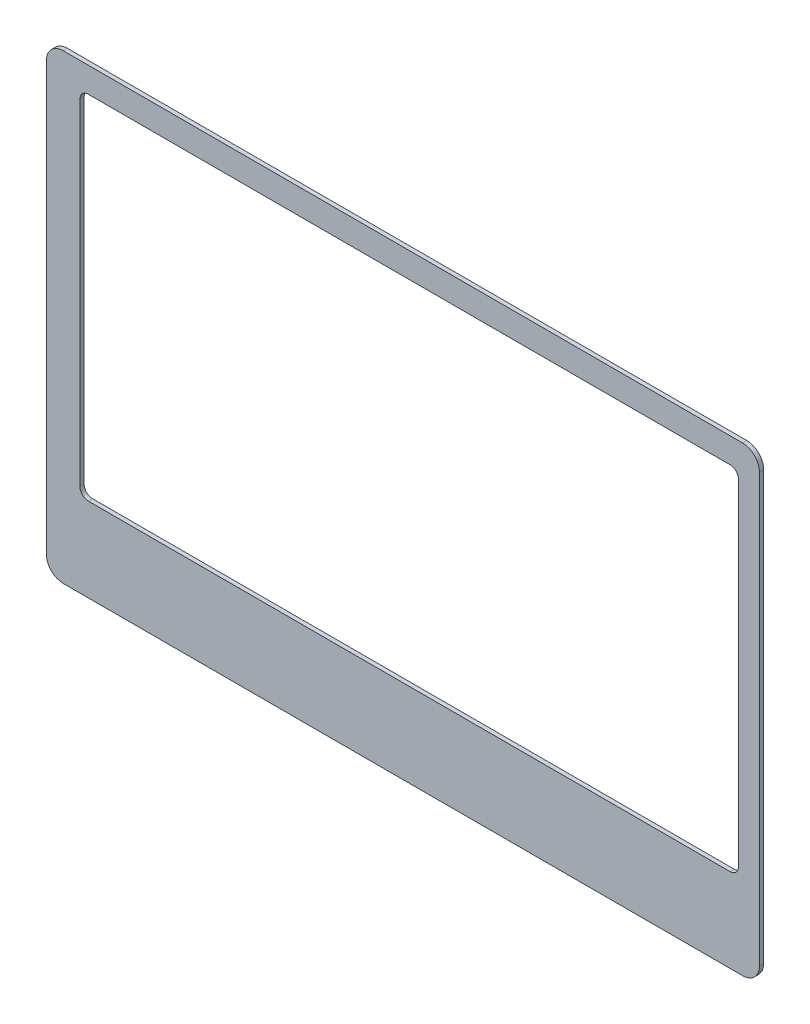
ISO-10303-21;
HEADER;
FILE_DESCRIPTION(('STEP AP214'),'2;1');
FILE_NAME('part.step','',(''),(''),'','','');
FILE_SCHEMA(('AUTOMOTIVE_DESIGN { 1 0 10303 214 1 1 1 1 }'));
ENDSEC;
DATA;
#1=APPLICATION_CONTEXT('core data for automotive mechanical design processes');
#2=APPLICATION_PROTOCOL_DEFINITION('international standard','automotive_design',2000,#1);
#3=PRODUCT_CONTEXT('',#1,'mechanical');
#4=PRODUCT('Part','Part','',(#3));
#5=PRODUCT_RELATED_PRODUCT_CATEGORY('part','',(#4));
#6=PRODUCT_DEFINITION_FORMATION('','',#4);
#7=PRODUCT_DEFINITION_CONTEXT('part definition',#1,'design');
#8=PRODUCT_DEFINITION('design','',#6,#7);
#9=PRODUCT_DEFINITION_SHAPE('','',#8);
#10=(LENGTH_UNIT() NAMED_UNIT(*) SI_UNIT(.MILLI.,.METRE.));
#11=(NAMED_UNIT(*) PLANE_ANGLE_UNIT() SI_UNIT($,.RADIAN.));
#12=(NAMED_UNIT(*) SI_UNIT($,.STERADIAN.) SOLID_ANGLE_UNIT());
#13=UNCERTAINTY_MEASURE_WITH_UNIT(LENGTH_MEASURE(1.E-05),#10,'distance_accuracy_value','');
#14=(GEOMETRIC_REPRESENTATION_CONTEXT(3) GLOBAL_UNCERTAINTY_ASSIGNED_CONTEXT((#13)) GLOBAL_UNIT_ASSIGNED_CONTEXT((#10,
#11,#12)) REPRESENTATION_CONTEXT('',''));
#15=CARTESIAN_POINT('',(0.,0.,0.));
#16=DIRECTION('',(0.,0.,1.));
#17=DIRECTION('',(1.,0.,0.));
#18=AXIS2_PLACEMENT_3D('',#15,#16,#17);
#19=CARTESIAN_POINT('',(42.5,27.5,0.5));
#20=DIRECTION('',(-1.,0.,0.));
#21=DIRECTION('',(0.,0.,1.));
#22=AXIS2_PLACEMENT_3D('',#19,#20,#21);
#23=PLANE('',#22);
#24=DIRECTION('',(0.,1.,0.));
#25=VECTOR('',#24,1.);
#26=CARTESIAN_POINT('',(42.5,27.5,0.5));
#27=LINE('',#26,#25);
#28=CARTESIAN_POINT('',(42.5,-25.5,0.5));
#29=VERTEX_POINT('',#28);
#30=CARTESIAN_POINT('',(42.5,25.5,0.5));
#31=VERTEX_POINT('',#30);
#32=EDGE_CURVE('E245',#29,#31,#27,.T.);
#33=ORIENTED_EDGE('',*,*,#32,.F.);
#34=DIRECTION('',(0.,0.,-1.));
#35=VECTOR('',#34,1.);
#36=CARTESIAN_POINT('',(42.5,-25.5,0.5));
#37=LINE('',#36,#35);
#38=CARTESIAN_POINT('',(42.5,-25.5,0.));
#39=VERTEX_POINT('',#38);
#40=EDGE_CURVE('E276',#29,#39,#37,.T.);
#41=ORIENTED_EDGE('',*,*,#40,.T.);
#42=DIRECTION('',(0.,1.,0.));
#43=VECTOR('',#42,1.);
#44=CARTESIAN_POINT('',(42.5,27.5,0.));
#45=LINE('',#44,#43);
#46=CARTESIAN_POINT('',(42.5,25.5,0.));
#47=VERTEX_POINT('',#46);
#48=EDGE_CURVE('E183',#39,#47,#45,.T.);
#49=ORIENTED_EDGE('',*,*,#48,.T.);
#50=DIRECTION('',(0.,0.,-1.));
#51=VECTOR('',#50,1.);
#52=CARTESIAN_POINT('',(42.5,25.5,0.5));
#53=LINE('',#52,#51);
#54=EDGE_CURVE('E260',#47,#31,#53,.F.);
#55=ORIENTED_EDGE('',*,*,#54,.T.);
#56=EDGE_LOOP('',(#33,#41,#49,#55));
#57=FACE_BOUND('',#56,.T.);
#58=ADVANCED_FACE('F45',(#57),#23,.F.);
#59=CARTESIAN_POINT('',(-42.5,27.5,0.5));
#60=DIRECTION('',(0.,-1.,0.));
#61=DIRECTION('',(0.,0.,-1.));
#62=AXIS2_PLACEMENT_3D('',#59,#60,#61);
#63=PLANE('',#62);
#64=DIRECTION('',(-1.,0.,0.));
#65=VECTOR('',#64,1.);
#66=CARTESIAN_POINT('',(-42.5,27.5,0.5));
#67=LINE('',#66,#65);
#68=CARTESIAN_POINT('',(40.5,27.5,0.5));
#69=VERTEX_POINT('',#68);
#70=CARTESIAN_POINT('',(-40.5,27.5,0.5));
#71=VERTEX_POINT('',#70);
#72=EDGE_CURVE('E249',#69,#71,#67,.T.);
#73=ORIENTED_EDGE('',*,*,#72,.F.);
#74=DIRECTION('',(0.,0.,-1.));
#75=VECTOR('',#74,1.);
#76=CARTESIAN_POINT('',(40.5,27.5,0.5));
#77=LINE('',#76,#75);
#78=CARTESIAN_POINT('',(40.5,27.5,0.));
#79=VERTEX_POINT('',#78);
#80=EDGE_CURVE('E11',#69,#79,#77,.T.);
#81=ORIENTED_EDGE('',*,*,#80,.T.);
#82=DIRECTION('',(-1.,0.,0.));
#83=VECTOR('',#82,1.);
#84=CARTESIAN_POINT('',(-42.5,27.5,0.));
#85=LINE('',#84,#83);
#86=CARTESIAN_POINT('',(-40.5,27.5,0.));
#87=VERTEX_POINT('',#86);
#88=EDGE_CURVE('E264',#79,#87,#85,.T.);
#89=ORIENTED_EDGE('',*,*,#88,.T.);
#90=DIRECTION('',(0.,0.,-1.));
#91=VECTOR('',#90,1.);
#92=CARTESIAN_POINT('',(-40.5,27.5,0.5));
#93=LINE('',#92,#91);
#94=EDGE_CURVE('E54',#87,#71,#93,.F.);
#95=ORIENTED_EDGE('',*,*,#94,.T.);
#96=EDGE_LOOP('',(#73,#81,#89,#95));
#97=FACE_BOUND('',#96,.T.);
#98=ADVANCED_FACE('F319',(#97),#63,.F.);
#99=CARTESIAN_POINT('',(-42.5,27.5,0.5));
#100=DIRECTION('',(1.,0.,0.));
#101=DIRECTION('',(0.,1.,0.));
#102=AXIS2_PLACEMENT_3D('',#99,#100,#101);
#103=PLANE('',#102);
#104=DIRECTION('',(0.,-1.,0.));
#105=VECTOR('',#104,1.);
#106=CARTESIAN_POINT('',(-42.5,27.5,0.));
#107=LINE('',#106,#105);
#108=CARTESIAN_POINT('',(-42.5,25.5,0.));
#109=VERTEX_POINT('',#108);
#110=CARTESIAN_POINT('',(-42.5,-25.5,0.));
#111=VERTEX_POINT('',#110);
#112=EDGE_CURVE('E268',#109,#111,#107,.T.);
#113=ORIENTED_EDGE('',*,*,#112,.T.);
#114=DIRECTION('',(0.,0.,-1.));
#115=VECTOR('',#114,1.);
#116=CARTESIAN_POINT('',(-42.5,-25.5,0.5));
#117=LINE('',#116,#115);
#118=CARTESIAN_POINT('',(-42.5,-25.5,0.5));
#119=VERTEX_POINT('',#118);
#120=EDGE_CURVE('E61',#111,#119,#117,.F.);
#121=ORIENTED_EDGE('',*,*,#120,.T.);
#122=DIRECTION('',(0.,-1.,0.));
#123=VECTOR('',#122,1.);
#124=CARTESIAN_POINT('',(-42.5,27.5,0.5));
#125=LINE('',#124,#123);
#126=CARTESIAN_POINT('',(-42.5,25.5,0.5));
#127=VERTEX_POINT('',#126);
#128=EDGE_CURVE('E253',#127,#119,#125,.T.);
#129=ORIENTED_EDGE('',*,*,#128,.F.);
#130=DIRECTION('',(0.,0.,-1.));
#131=VECTOR('',#130,1.);
#132=CARTESIAN_POINT('',(-42.5,25.5,0.5));
#133=LINE('',#132,#131);
#134=EDGE_CURVE('E310',#127,#109,#133,.T.);
#135=ORIENTED_EDGE('',*,*,#134,.T.);
#136=EDGE_LOOP('',(#113,#121,#129,#135));
#137=FACE_BOUND('',#136,.T.);
#138=ADVANCED_FACE('F327',(#137),#103,.F.);
#139=CARTESIAN_POINT('',(-42.5,-27.5,0.5));
#140=DIRECTION('',(0.,1.,0.));
#141=DIRECTION('',(0.,0.,1.));
#142=AXIS2_PLACEMENT_3D('',#139,#140,#141);
#143=PLANE('',#142);
#144=DIRECTION('',(1.,0.,0.));
#145=VECTOR('',#144,1.);
#146=CARTESIAN_POINT('',(-42.5,-27.5,0.));
#147=LINE('',#146,#145);
#148=CARTESIAN_POINT('',(-40.5,-27.5,0.));
#149=VERTEX_POINT('',#148);
#150=CARTESIAN_POINT('',(40.5,-27.5,0.));
#151=VERTEX_POINT('',#150);
#152=EDGE_CURVE('E250',#149,#151,#147,.T.);
#153=ORIENTED_EDGE('',*,*,#152,.T.);
#154=DIRECTION('',(0.,0.,-1.));
#155=VECTOR('',#154,1.);
#156=CARTESIAN_POINT('',(40.5,-27.5,0.5));
#157=LINE('',#156,#155);
#158=CARTESIAN_POINT('',(40.5,-27.5,0.5));
#159=VERTEX_POINT('',#158);
#160=EDGE_CURVE('E296',#151,#159,#157,.F.);
#161=ORIENTED_EDGE('',*,*,#160,.T.);
#162=DIRECTION('',(1.,0.,0.));
#163=VECTOR('',#162,1.);
#164=CARTESIAN_POINT('',(-42.5,-27.5,0.5));
#165=LINE('',#164,#163);
#166=CARTESIAN_POINT('',(-40.5,-27.5,0.5));
#167=VERTEX_POINT('',#166);
#168=EDGE_CURVE('E256',#167,#159,#165,.T.);
#169=ORIENTED_EDGE('',*,*,#168,.F.);
#170=DIRECTION('',(0.,0.,-1.));
#171=VECTOR('',#170,1.);
#172=CARTESIAN_POINT('',(-40.5,-27.5,0.5));
#173=LINE('',#172,#171);
#174=EDGE_CURVE('E292',#167,#149,#173,.T.);
#175=ORIENTED_EDGE('',*,*,#174,.T.);
#176=EDGE_LOOP('',(#153,#161,#169,#175));
#177=FACE_BOUND('',#176,.T.);
#178=ADVANCED_FACE('F336',(#177),#143,.F.);
#179=CARTESIAN_POINT('',(0.,0.,0.5));
#180=DIRECTION('',(0.,0.,1.));
#181=DIRECTION('',(1.,0.,0.));
#182=AXIS2_PLACEMENT_3D('',#179,#180,#181);
#183=PLANE('',#182);
#184=CARTESIAN_POINT('',(-37.5,-16.5,0.5));
#185=DIRECTION('',(0.,0.,1.));
#186=DIRECTION('',(1.,0.,0.));
#187=AXIS2_PLACEMENT_3D('',#184,#185,#186);
#188=CIRCLE('',#187,1.);
#189=CARTESIAN_POINT('',(-38.5,-16.5,0.5));
#190=VERTEX_POINT('',#189);
#191=CARTESIAN_POINT('',(-37.5,-17.5,0.5));
#192=VERTEX_POINT('',#191);
#193=EDGE_CURVE('E168',#190,#192,#188,.T.);
#194=ORIENTED_EDGE('',*,*,#193,.F.);
#195=DIRECTION('',(0.,-1.,0.));
#196=VECTOR('',#195,1.);
#197=CARTESIAN_POINT('',(-38.5,23.5,0.5));
#198=LINE('',#197,#196);
#199=CARTESIAN_POINT('',(-38.5,23.5,0.5));
#200=VERTEX_POINT('',#199);
#201=EDGE_CURVE('E174',#200,#190,#198,.T.);
#202=ORIENTED_EDGE('',*,*,#201,.F.);
#203=CARTESIAN_POINT('',(-37.5,23.5,0.5));
#204=DIRECTION('',(0.,0.,1.));
#205=DIRECTION('',(1.,0.,0.));
#206=AXIS2_PLACEMENT_3D('',#203,#204,#205);
#207=CIRCLE('',#206,1.);
#208=CARTESIAN_POINT('',(-37.5,24.5,0.5));
#209=VERTEX_POINT('',#208);
#210=EDGE_CURVE('E219',#209,#200,#207,.T.);
#211=ORIENTED_EDGE('',*,*,#210,.F.);
#212=DIRECTION('',(-1.,0.,0.));
#213=VECTOR('',#212,1.);
#214=CARTESIAN_POINT('',(-37.5,24.5,0.5));
#215=LINE('',#214,#213);
#216=CARTESIAN_POINT('',(39.,24.5,0.5));
#217=VERTEX_POINT('',#216);
#218=EDGE_CURVE('E215',#217,#209,#215,.T.);
#219=ORIENTED_EDGE('',*,*,#218,.F.);
#220=CARTESIAN_POINT('',(39.,23.5,0.5));
#221=DIRECTION('',(0.,0.,1.));
#222=DIRECTION('',(-1.,0.,0.));
#223=AXIS2_PLACEMENT_3D('',#220,#221,#222);
#224=CIRCLE('',#223,1.);
#225=CARTESIAN_POINT('',(40.,23.5,0.5));
#226=VERTEX_POINT('',#225);
#227=EDGE_CURVE('E211',#226,#217,#224,.T.);
#228=ORIENTED_EDGE('',*,*,#227,.F.);
#229=DIRECTION('',(0.,1.,0.));
#230=VECTOR('',#229,1.);
#231=CARTESIAN_POINT('',(40.,23.5,0.5));
#232=LINE('',#231,#230);
#233=CARTESIAN_POINT('',(40.,-16.5,0.5));
#234=VERTEX_POINT('',#233);
#235=EDGE_CURVE('E207',#234,#226,#232,.T.);
#236=ORIENTED_EDGE('',*,*,#235,.F.);
#237=CARTESIAN_POINT('',(39.,-16.5,0.5));
#238=DIRECTION('',(0.,0.,1.));
#239=DIRECTION('',(1.,0.,0.));
#240=AXIS2_PLACEMENT_3D('',#237,#238,#239);
#241=CIRCLE('',#240,1.);
#242=CARTESIAN_POINT('',(39.,-17.5,0.5));
#243=VERTEX_POINT('',#242);
#244=EDGE_CURVE('E203',#243,#234,#241,.T.);
#245=ORIENTED_EDGE('',*,*,#244,.F.);
#246=DIRECTION('',(1.,0.,0.));
#247=VECTOR('',#246,1.);
#248=CARTESIAN_POINT('',(-37.5,-17.5,0.5));
#249=LINE('',#248,#247);
#250=EDGE_CURVE('E195',#192,#243,#249,.T.);
#251=ORIENTED_EDGE('',*,*,#250,.F.);
#252=EDGE_LOOP('',(#194,#202,#211,#219,#228,#236,#245,#251));
#253=FACE_BOUND('',#252,.T.);
#254=ORIENTED_EDGE('',*,*,#168,.T.);
#255=CARTESIAN_POINT('',(40.5,-25.5,0.5));
#256=DIRECTION('',(0.,0.,1.));
#257=DIRECTION('',(1.,0.,0.));
#258=AXIS2_PLACEMENT_3D('',#255,#256,#257);
#259=CIRCLE('',#258,2.);
#260=EDGE_CURVE('E307',#159,#29,#259,.T.);
#261=ORIENTED_EDGE('',*,*,#260,.T.);
#262=ORIENTED_EDGE('',*,*,#32,.T.);
#263=CARTESIAN_POINT('',(40.5,25.5,0.5));
#264=DIRECTION('',(0.,0.,1.));
#265=DIRECTION('',(1.,0.,0.));
#266=AXIS2_PLACEMENT_3D('',#263,#264,#265);
#267=CIRCLE('',#266,2.);
#268=EDGE_CURVE('E301',#31,#69,#267,.T.);
#269=ORIENTED_EDGE('',*,*,#268,.T.);
#270=ORIENTED_EDGE('',*,*,#72,.T.);
#271=CARTESIAN_POINT('',(-40.5,25.5,0.5));
#272=DIRECTION('',(0.,0.,1.));
#273=DIRECTION('',(1.,0.,0.));
#274=AXIS2_PLACEMENT_3D('',#271,#272,#273);
#275=CIRCLE('',#274,2.);
#276=EDGE_CURVE('E68',#71,#127,#275,.T.);
#277=ORIENTED_EDGE('',*,*,#276,.T.);
#278=ORIENTED_EDGE('',*,*,#128,.T.);
#279=CARTESIAN_POINT('',(-40.5,-25.5,0.5));
#280=DIRECTION('',(0.,0.,1.));
#281=DIRECTION('',(1.,0.,0.));
#282=AXIS2_PLACEMENT_3D('',#279,#280,#281);
#283=CIRCLE('',#282,2.);
#284=EDGE_CURVE('E304',#119,#167,#283,.T.);
#285=ORIENTED_EDGE('',*,*,#284,.T.);
#286=EDGE_LOOP('',(#254,#261,#262,#269,#270,#277,#278,#285));
#287=FACE_BOUND('',#286,.T.);
#288=ADVANCED_FACE('F323',(#253,#287),#183,.T.);
#289=CARTESIAN_POINT('',(0.,0.,0.));
#290=DIRECTION('',(0.,0.,1.));
#291=DIRECTION('',(1.,0.,0.));
#292=AXIS2_PLACEMENT_3D('',#289,#290,#291);
#293=PLANE('',#292);
#294=DIRECTION('',(0.,1.,0.));
#295=VECTOR('',#294,1.);
#296=CARTESIAN_POINT('',(-38.5,23.5,0.));
#297=LINE('',#296,#295);
#298=CARTESIAN_POINT('',(-38.5,-16.5,0.));
#299=VERTEX_POINT('',#298);
#300=CARTESIAN_POINT('',(-38.5,23.5,0.));
#301=VERTEX_POINT('',#300);
#302=EDGE_CURVE('E190',#299,#301,#297,.T.);
#303=ORIENTED_EDGE('',*,*,#302,.F.);
#304=CARTESIAN_POINT('',(-37.5,-16.5,0.));
#305=DIRECTION('',(0.,0.,1.));
#306=DIRECTION('',(1.,0.,0.));
#307=AXIS2_PLACEMENT_3D('',#304,#305,#306);
#308=CIRCLE('',#307,1.);
#309=CARTESIAN_POINT('',(-37.5,-17.5,0.));
#310=VERTEX_POINT('',#309);
#311=EDGE_CURVE('E165',#310,#299,#308,.F.);
#312=ORIENTED_EDGE('',*,*,#311,.F.);
#313=DIRECTION('',(-1.,0.,0.));
#314=VECTOR('',#313,1.);
#315=CARTESIAN_POINT('',(-37.5,-17.5,0.));
#316=LINE('',#315,#314);
#317=CARTESIAN_POINT('',(39.,-17.5,0.));
#318=VERTEX_POINT('',#317);
#319=EDGE_CURVE('E178',#318,#310,#316,.T.);
#320=ORIENTED_EDGE('',*,*,#319,.F.);
#321=CARTESIAN_POINT('',(39.,-16.5,0.));
#322=DIRECTION('',(0.,0.,1.));
#323=DIRECTION('',(1.,0.,0.));
#324=AXIS2_PLACEMENT_3D('',#321,#322,#323);
#325=CIRCLE('',#324,1.);
#326=CARTESIAN_POINT('',(40.,-16.5,0.));
#327=VERTEX_POINT('',#326);
#328=EDGE_CURVE('E498',#327,#318,#325,.F.);
#329=ORIENTED_EDGE('',*,*,#328,.F.);
#330=DIRECTION('',(0.,-1.,0.));
#331=VECTOR('',#330,1.);
#332=CARTESIAN_POINT('',(40.,23.5,0.));
#333=LINE('',#332,#331);
#334=CARTESIAN_POINT('',(40.,23.5,0.));
#335=VERTEX_POINT('',#334);
#336=EDGE_CURVE('E493',#335,#327,#333,.T.);
#337=ORIENTED_EDGE('',*,*,#336,.F.);
#338=CARTESIAN_POINT('',(39.,23.5,0.));
#339=DIRECTION('',(0.,0.,1.));
#340=DIRECTION('',(1.,0.,0.));
#341=AXIS2_PLACEMENT_3D('',#338,#339,#340);
#342=CIRCLE('',#341,1.);
#343=CARTESIAN_POINT('',(39.,24.5,0.));
#344=VERTEX_POINT('',#343);
#345=EDGE_CURVE('E497',#344,#335,#342,.F.);
#346=ORIENTED_EDGE('',*,*,#345,.F.);
#347=DIRECTION('',(1.,0.,0.));
#348=VECTOR('',#347,1.);
#349=CARTESIAN_POINT('',(-37.5,24.5,0.));
#350=LINE('',#349,#348);
#351=CARTESIAN_POINT('',(-37.5,24.5,0.));
#352=VERTEX_POINT('',#351);
#353=EDGE_CURVE('E505',#352,#344,#350,.T.);
#354=ORIENTED_EDGE('',*,*,#353,.F.);
#355=CARTESIAN_POINT('',(-37.5,23.5,0.));
#356=DIRECTION('',(0.,0.,1.));
#357=DIRECTION('',(1.,0.,0.));
#358=AXIS2_PLACEMENT_3D('',#355,#356,#357);
#359=CIRCLE('',#358,1.);
#360=EDGE_CURVE('E197',#301,#352,#359,.F.);
#361=ORIENTED_EDGE('',*,*,#360,.F.);
#362=EDGE_LOOP('',(#303,#312,#320,#329,#337,#346,#354,#361));
#363=FACE_BOUND('',#362,.T.);
#364=ORIENTED_EDGE('',*,*,#48,.F.);
#365=CARTESIAN_POINT('',(40.5,-25.5,0.));
#366=DIRECTION('',(0.,0.,1.));
#367=DIRECTION('',(1.,0.,0.));
#368=AXIS2_PLACEMENT_3D('',#365,#366,#367);
#369=CIRCLE('',#368,2.);
#370=EDGE_CURVE('E289',#39,#151,#369,.F.);
#371=ORIENTED_EDGE('',*,*,#370,.T.);
#372=ORIENTED_EDGE('',*,*,#152,.F.);
#373=CARTESIAN_POINT('',(-40.5,-25.5,0.));
#374=DIRECTION('',(0.,0.,1.));
#375=DIRECTION('',(1.,0.,0.));
#376=AXIS2_PLACEMENT_3D('',#373,#374,#375);
#377=CIRCLE('',#376,2.);
#378=EDGE_CURVE('E286',#149,#111,#377,.F.);
#379=ORIENTED_EDGE('',*,*,#378,.T.);
#380=ORIENTED_EDGE('',*,*,#112,.F.);
#381=CARTESIAN_POINT('',(-40.5,25.5,0.));
#382=DIRECTION('',(0.,0.,1.));
#383=DIRECTION('',(1.,0.,0.));
#384=AXIS2_PLACEMENT_3D('',#381,#382,#383);
#385=CIRCLE('',#384,2.);
#386=EDGE_CURVE('E280',#109,#87,#385,.F.);
#387=ORIENTED_EDGE('',*,*,#386,.T.);
#388=ORIENTED_EDGE('',*,*,#88,.F.);
#389=CARTESIAN_POINT('',(40.5,25.5,0.));
#390=DIRECTION('',(0.,0.,1.));
#391=DIRECTION('',(1.,0.,0.));
#392=AXIS2_PLACEMENT_3D('',#389,#390,#391);
#393=CIRCLE('',#392,2.);
#394=EDGE_CURVE('E283',#79,#47,#393,.F.);
#395=ORIENTED_EDGE('',*,*,#394,.T.);
#396=EDGE_LOOP('',(#364,#371,#372,#379,#380,#387,#388,#395));
#397=FACE_BOUND('',#396,.T.);
#398=ADVANCED_FACE('F186',(#363,#397),#293,.F.);
#399=CARTESIAN_POINT('',(-37.5,-16.5,-0.00100000000000002));
#400=DIRECTION('',(0.,0.,1.));
#401=DIRECTION('',(1.,0.,0.));
#402=AXIS2_PLACEMENT_3D('',#399,#400,#401);
#403=CYLINDRICAL_SURFACE('',#402,1.);
#404=ORIENTED_EDGE('',*,*,#311,.T.);
#405=DIRECTION('',(0.,0.,1.));
#406=VECTOR('',#405,1.);
#407=CARTESIAN_POINT('',(-38.5,-16.5,-0.00100000000000002));
#408=LINE('',#407,#406);
#409=EDGE_CURVE('E184',#299,#190,#408,.T.);
#410=ORIENTED_EDGE('',*,*,#409,.T.);
#411=ORIENTED_EDGE('',*,*,#193,.T.);
#412=DIRECTION('',(0.,0.,1.));
#413=VECTOR('',#412,1.);
#414=CARTESIAN_POINT('',(-37.5,-17.5,-0.00100000000000002));
#415=LINE('',#414,#413);
#416=EDGE_CURVE('E161',#310,#192,#415,.T.);
#417=ORIENTED_EDGE('',*,*,#416,.F.);
#418=EDGE_LOOP('',(#404,#410,#411,#417));
#419=FACE_BOUND('',#418,.T.);
#420=ADVANCED_FACE('F163',(#419),#403,.F.);
#421=CARTESIAN_POINT('',(-38.5,23.5,-0.00100000000000002));
#422=DIRECTION('',(-1.,0.,0.));
#423=DIRECTION('',(0.,-1.,0.));
#424=AXIS2_PLACEMENT_3D('',#421,#422,#423);
#425=PLANE('',#424);
#426=ORIENTED_EDGE('',*,*,#302,.T.);
#427=DIRECTION('',(0.,0.,1.));
#428=VECTOR('',#427,1.);
#429=CARTESIAN_POINT('',(-38.5,23.5,-0.00100000000000002));
#430=LINE('',#429,#428);
#431=EDGE_CURVE('E228',#301,#200,#430,.T.);
#432=ORIENTED_EDGE('',*,*,#431,.T.);
#433=ORIENTED_EDGE('',*,*,#201,.T.);
#434=ORIENTED_EDGE('',*,*,#409,.F.);
#435=EDGE_LOOP('',(#426,#432,#433,#434));
#436=FACE_BOUND('',#435,.T.);
#437=ADVANCED_FACE('F378',(#436),#425,.F.);
#438=CARTESIAN_POINT('',(-37.5,23.5,-0.00100000000000002));
#439=DIRECTION('',(0.,0.,1.));
#440=DIRECTION('',(1.,0.,0.));
#441=AXIS2_PLACEMENT_3D('',#438,#439,#440);
#442=CYLINDRICAL_SURFACE('',#441,1.);
#443=ORIENTED_EDGE('',*,*,#360,.T.);
#444=DIRECTION('',(0.,0.,1.));
#445=VECTOR('',#444,1.);
#446=CARTESIAN_POINT('',(-37.5,24.5,-0.00100000000000002));
#447=LINE('',#446,#445);
#448=EDGE_CURVE('E231',#352,#209,#447,.T.);
#449=ORIENTED_EDGE('',*,*,#448,.T.);
#450=ORIENTED_EDGE('',*,*,#210,.T.);
#451=ORIENTED_EDGE('',*,*,#431,.F.);
#452=EDGE_LOOP('',(#443,#449,#450,#451));
#453=FACE_BOUND('',#452,.T.);
#454=ADVANCED_FACE('F420',(#453),#442,.F.);
#455=CARTESIAN_POINT('',(-37.5,24.5,-0.00100000000000002));
#456=DIRECTION('',(0.,1.,0.));
#457=DIRECTION('',(0.,0.,1.));
#458=AXIS2_PLACEMENT_3D('',#455,#456,#457);
#459=PLANE('',#458);
#460=ORIENTED_EDGE('',*,*,#353,.T.);
#461=DIRECTION('',(0.,0.,1.));
#462=VECTOR('',#461,1.);
#463=CARTESIAN_POINT('',(39.,24.5,-0.00100000000000002));
#464=LINE('',#463,#462);
#465=EDGE_CURVE('E234',#344,#217,#464,.T.);
#466=ORIENTED_EDGE('',*,*,#465,.T.);
#467=ORIENTED_EDGE('',*,*,#218,.T.);
#468=ORIENTED_EDGE('',*,*,#448,.F.);
#469=EDGE_LOOP('',(#460,#466,#467,#468));
#470=FACE_BOUND('',#469,.T.);
#471=ADVANCED_FACE('F430',(#470),#459,.F.);
#472=CARTESIAN_POINT('',(39.,23.5,-0.00100000000000002));
#473=DIRECTION('',(0.,0.,1.));
#474=DIRECTION('',(1.,0.,0.));
#475=AXIS2_PLACEMENT_3D('',#472,#473,#474);
#476=CYLINDRICAL_SURFACE('',#475,1.);
#477=ORIENTED_EDGE('',*,*,#345,.T.);
#478=DIRECTION('',(0.,0.,1.));
#479=VECTOR('',#478,1.);
#480=CARTESIAN_POINT('',(40.,23.5,-0.00100000000000002));
#481=LINE('',#480,#479);
#482=EDGE_CURVE('E237',#335,#226,#481,.T.);
#483=ORIENTED_EDGE('',*,*,#482,.T.);
#484=ORIENTED_EDGE('',*,*,#227,.T.);
#485=ORIENTED_EDGE('',*,*,#465,.F.);
#486=EDGE_LOOP('',(#477,#483,#484,#485));
#487=FACE_BOUND('',#486,.T.);
#488=ADVANCED_FACE('F440',(#487),#476,.F.);
#489=CARTESIAN_POINT('',(40.,23.5,-0.00100000000000002));
#490=DIRECTION('',(1.,0.,0.));
#491=DIRECTION('',(0.,1.,0.));
#492=AXIS2_PLACEMENT_3D('',#489,#490,#491);
#493=PLANE('',#492);
#494=ORIENTED_EDGE('',*,*,#336,.T.);
#495=DIRECTION('',(0.,0.,1.));
#496=VECTOR('',#495,1.);
#497=CARTESIAN_POINT('',(40.,-16.5,-0.00100000000000002));
#498=LINE('',#497,#496);
#499=EDGE_CURVE('E240',#327,#234,#498,.T.);
#500=ORIENTED_EDGE('',*,*,#499,.T.);
#501=ORIENTED_EDGE('',*,*,#235,.T.);
#502=ORIENTED_EDGE('',*,*,#482,.F.);
#503=EDGE_LOOP('',(#494,#500,#501,#502));
#504=FACE_BOUND('',#503,.T.);
#505=ADVANCED_FACE('F371',(#504),#493,.F.);
#506=CARTESIAN_POINT('',(39.,-16.5,-0.00100000000000002));
#507=DIRECTION('',(0.,0.,1.));
#508=DIRECTION('',(1.,0.,0.));
#509=AXIS2_PLACEMENT_3D('',#506,#507,#508);
#510=CYLINDRICAL_SURFACE('',#509,1.);
#511=ORIENTED_EDGE('',*,*,#328,.T.);
#512=DIRECTION('',(0.,0.,1.));
#513=VECTOR('',#512,1.);
#514=CARTESIAN_POINT('',(39.,-17.5,-0.00100000000000002));
#515=LINE('',#514,#513);
#516=EDGE_CURVE('E173',#318,#243,#515,.T.);
#517=ORIENTED_EDGE('',*,*,#516,.T.);
#518=ORIENTED_EDGE('',*,*,#244,.T.);
#519=ORIENTED_EDGE('',*,*,#499,.F.);
#520=EDGE_LOOP('',(#511,#517,#518,#519));
#521=FACE_BOUND('',#520,.T.);
#522=ADVANCED_FACE('F366',(#521),#510,.F.);
#523=CARTESIAN_POINT('',(-37.5,-17.5,-0.00100000000000002));
#524=DIRECTION('',(0.,-1.,0.));
#525=DIRECTION('',(0.,0.,-1.));
#526=AXIS2_PLACEMENT_3D('',#523,#524,#525);
#527=PLANE('',#526);
#528=ORIENTED_EDGE('',*,*,#319,.T.);
#529=ORIENTED_EDGE('',*,*,#416,.T.);
#530=ORIENTED_EDGE('',*,*,#250,.T.);
#531=ORIENTED_EDGE('',*,*,#516,.F.);
#532=EDGE_LOOP('',(#528,#529,#530,#531));
#533=FACE_BOUND('',#532,.T.);
#534=ADVANCED_FACE('F179',(#533),#527,.F.);
#535=CARTESIAN_POINT('',(40.5,-25.5,0.5));
#536=DIRECTION('',(0.,0.,-1.));
#537=DIRECTION('',(-1.,0.,0.));
#538=AXIS2_PLACEMENT_3D('',#535,#536,#537);
#539=CYLINDRICAL_SURFACE('',#538,2.);
#540=ORIENTED_EDGE('',*,*,#260,.F.);
#541=ORIENTED_EDGE('',*,*,#160,.F.);
#542=ORIENTED_EDGE('',*,*,#370,.F.);
#543=ORIENTED_EDGE('',*,*,#40,.F.);
#544=EDGE_LOOP('',(#540,#541,#542,#543));
#545=FACE_BOUND('',#544,.T.);
#546=ADVANCED_FACE('F342',(#545),#539,.T.);
#547=CARTESIAN_POINT('',(-40.5,-25.5,0.5));
#548=DIRECTION('',(0.,0.,-1.));
#549=DIRECTION('',(-1.,0.,0.));
#550=AXIS2_PLACEMENT_3D('',#547,#548,#549);
#551=CYLINDRICAL_SURFACE('',#550,2.);
#552=ORIENTED_EDGE('',*,*,#284,.F.);
#553=ORIENTED_EDGE('',*,*,#120,.F.);
#554=ORIENTED_EDGE('',*,*,#378,.F.);
#555=ORIENTED_EDGE('',*,*,#174,.F.);
#556=EDGE_LOOP('',(#552,#553,#554,#555));
#557=FACE_BOUND('',#556,.T.);
#558=ADVANCED_FACE('F333',(#557),#551,.T.);
#559=CARTESIAN_POINT('',(40.5,25.5,0.5));
#560=DIRECTION('',(0.,0.,-1.));
#561=DIRECTION('',(-1.,0.,0.));
#562=AXIS2_PLACEMENT_3D('',#559,#560,#561);
#563=CYLINDRICAL_SURFACE('',#562,2.);
#564=ORIENTED_EDGE('',*,*,#268,.F.);
#565=ORIENTED_EDGE('',*,*,#54,.F.);
#566=ORIENTED_EDGE('',*,*,#394,.F.);
#567=ORIENTED_EDGE('',*,*,#80,.F.);
#568=EDGE_LOOP('',(#564,#565,#566,#567));
#569=FACE_BOUND('',#568,.T.);
#570=ADVANCED_FACE('F346',(#569),#563,.T.);
#571=CARTESIAN_POINT('',(-40.5,25.5,0.5));
#572=DIRECTION('',(0.,0.,-1.));
#573=DIRECTION('',(-1.,0.,0.));
#574=AXIS2_PLACEMENT_3D('',#571,#572,#573);
#575=CYLINDRICAL_SURFACE('',#574,2.);
#576=ORIENTED_EDGE('',*,*,#276,.F.);
#577=ORIENTED_EDGE('',*,*,#94,.F.);
#578=ORIENTED_EDGE('',*,*,#386,.F.);
#579=ORIENTED_EDGE('',*,*,#134,.F.);
#580=EDGE_LOOP('',(#576,#577,#578,#579));
#581=FACE_BOUND('',#580,.T.);
#582=ADVANCED_FACE('F47',(#581),#575,.T.);
#583=CLOSED_SHELL('',(#58,#98,#138,#178,#288,#398,#420,#437,#454,#471,#488,#505,#522,#534,#546,
#558,#570,#582));
#584=MANIFOLD_SOLID_BREP('B2',#583);
#585=ADVANCED_BREP_SHAPE_REPRESENTATION('',(#18,#584),#14);
#586=SHAPE_DEFINITION_REPRESENTATION(#9,#585);
ENDSEC;
END-ISO-10303-21;
